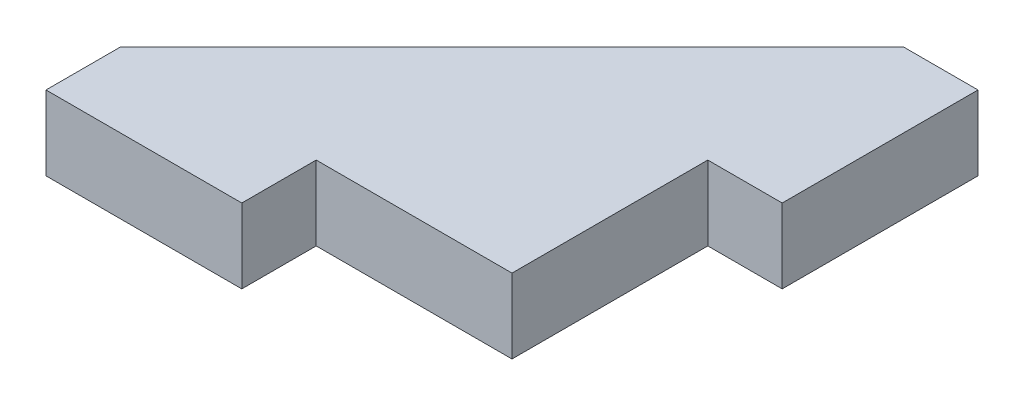
ISO-10303-21;
HEADER;
FILE_DESCRIPTION(('STEP AP214'),'2;1');
FILE_NAME('part.step','',(''),(''),'','','');
FILE_SCHEMA(('AUTOMOTIVE_DESIGN { 1 0 10303 214 1 1 1 1 }'));
ENDSEC;
DATA;
#1=APPLICATION_CONTEXT('core data for automotive mechanical design processes');
#2=APPLICATION_PROTOCOL_DEFINITION('international standard','automotive_design',2000,#1);
#3=PRODUCT_CONTEXT('',#1,'mechanical');
#4=PRODUCT('Part','Part','',(#3));
#5=PRODUCT_RELATED_PRODUCT_CATEGORY('part','',(#4));
#6=PRODUCT_DEFINITION_FORMATION('','',#4);
#7=PRODUCT_DEFINITION_CONTEXT('part definition',#1,'design');
#8=PRODUCT_DEFINITION('design','',#6,#7);
#9=PRODUCT_DEFINITION_SHAPE('','',#8);
#10=(LENGTH_UNIT() NAMED_UNIT(*) SI_UNIT(.MILLI.,.METRE.));
#11=(NAMED_UNIT(*) PLANE_ANGLE_UNIT() SI_UNIT($,.RADIAN.));
#12=(NAMED_UNIT(*) SI_UNIT($,.STERADIAN.) SOLID_ANGLE_UNIT());
#13=UNCERTAINTY_MEASURE_WITH_UNIT(LENGTH_MEASURE(1.E-05),#10,'distance_accuracy_value','');
#14=(GEOMETRIC_REPRESENTATION_CONTEXT(3) GLOBAL_UNCERTAINTY_ASSIGNED_CONTEXT((#13)) GLOBAL_UNIT_ASSIGNED_CONTEXT((#10,
#11,#12)) REPRESENTATION_CONTEXT('',''));
#15=CARTESIAN_POINT('',(0.,0.,0.));
#16=DIRECTION('',(0.,0.,1.));
#17=DIRECTION('',(1.,0.,0.));
#18=AXIS2_PLACEMENT_3D('',#15,#16,#17);
#19=CARTESIAN_POINT('',(-8.36198543722724,4.826,0.));
#20=DIRECTION('',(1.,0.,0.));
#21=DIRECTION('',(0.,0.,-1.));
#22=AXIS2_PLACEMENT_3D('',#19,#20,#21);
#23=PLANE('',#22);
#24=DIRECTION('',(0.,0.,1.));
#25=VECTOR('',#24,1.);
#26=CARTESIAN_POINT('',(-8.36198543722724,0.,0.));
#27=LINE('',#26,#25);
#28=CARTESIAN_POINT('',(-8.36198543722724,0.,13.62211422302));
#29=VERTEX_POINT('',#28);
#30=CARTESIAN_POINT('',(-8.36198543722724,0.,18.44811422302));
#31=VERTEX_POINT('',#30);
#32=EDGE_CURVE('E136',#29,#31,#27,.T.);
#33=ORIENTED_EDGE('',*,*,#32,.F.);
#34=DIRECTION('',(0.,-1.,0.));
#35=VECTOR('',#34,1.);
#36=CARTESIAN_POINT('',(-8.36198543722724,4.826,13.62211422302));
#37=LINE('',#36,#35);
#38=CARTESIAN_POINT('',(-8.36198543722724,4.826,13.62211422302));
#39=VERTEX_POINT('',#38);
#40=EDGE_CURVE('E11',#39,#29,#37,.T.);
#41=ORIENTED_EDGE('',*,*,#40,.F.);
#42=DIRECTION('',(0.,0.,1.));
#43=VECTOR('',#42,1.);
#44=CARTESIAN_POINT('',(-8.36198543722724,4.826,0.));
#45=LINE('',#44,#43);
#46=CARTESIAN_POINT('',(-8.36198543722724,4.826,18.44811422302));
#47=VERTEX_POINT('',#46);
#48=EDGE_CURVE('E158',#39,#47,#45,.T.);
#49=ORIENTED_EDGE('',*,*,#48,.T.);
#50=DIRECTION('',(0.,-1.,0.));
#51=VECTOR('',#50,1.);
#52=CARTESIAN_POINT('',(-8.36198543722724,4.826,18.44811422302));
#53=LINE('',#52,#51);
#54=EDGE_CURVE('E88',#47,#31,#53,.T.);
#55=ORIENTED_EDGE('',*,*,#54,.T.);
#56=EDGE_LOOP('',(#33,#41,#49,#55));
#57=FACE_BOUND('',#56,.T.);
#58=ADVANCED_FACE('F35',(#57),#23,.T.);
#59=CARTESIAN_POINT('',(0.,4.826,13.62211422302));
#60=DIRECTION('',(0.,0.,-1.));
#61=DIRECTION('',(-1.,0.,0.));
#62=AXIS2_PLACEMENT_3D('',#59,#60,#61);
#63=PLANE('',#62);
#64=DIRECTION('',(1.,0.,0.));
#65=VECTOR('',#64,1.);
#66=CARTESIAN_POINT('',(0.,0.,13.62211422302));
#67=LINE('',#66,#65);
#68=CARTESIAN_POINT('',(4.33801456277276,0.,13.62211422302));
#69=VERTEX_POINT('',#68);
#70=EDGE_CURVE('E139',#29,#69,#67,.T.);
#71=ORIENTED_EDGE('',*,*,#70,.T.);
#72=DIRECTION('',(0.,-1.,0.));
#73=VECTOR('',#72,1.);
#74=CARTESIAN_POINT('',(4.33801456277276,4.826,13.62211422302));
#75=LINE('',#74,#73);
#76=CARTESIAN_POINT('',(4.33801456277276,4.826,13.62211422302));
#77=VERTEX_POINT('',#76);
#78=EDGE_CURVE('E43',#77,#69,#75,.T.);
#79=ORIENTED_EDGE('',*,*,#78,.F.);
#80=DIRECTION('',(1.,0.,0.));
#81=VECTOR('',#80,1.);
#82=CARTESIAN_POINT('',(0.,4.826,13.62211422302));
#83=LINE('',#82,#81);
#84=EDGE_CURVE('E188',#39,#77,#83,.T.);
#85=ORIENTED_EDGE('',*,*,#84,.F.);
#86=ORIENTED_EDGE('',*,*,#40,.T.);
#87=EDGE_LOOP('',(#71,#79,#85,#86));
#88=FACE_BOUND('',#87,.T.);
#89=ADVANCED_FACE('F176',(#88),#63,.F.);
#90=CARTESIAN_POINT('',(4.33801456277275,4.826,0.));
#91=DIRECTION('',(1.,0.,0.));
#92=DIRECTION('',(0.,0.,-1.));
#93=AXIS2_PLACEMENT_3D('',#90,#91,#92);
#94=PLANE('',#93);
#95=DIRECTION('',(0.,0.,1.));
#96=VECTOR('',#95,1.);
#97=CARTESIAN_POINT('',(4.33801456277275,0.,0.));
#98=LINE('',#97,#96);
#99=CARTESIAN_POINT('',(4.33801456277275,0.,0.922114223020031));
#100=VERTEX_POINT('',#99);
#101=EDGE_CURVE('E142',#100,#69,#98,.T.);
#102=ORIENTED_EDGE('',*,*,#101,.F.);
#103=DIRECTION('',(0.,-1.,0.));
#104=VECTOR('',#103,1.);
#105=CARTESIAN_POINT('',(4.33801456277275,4.826,0.922114223020031));
#106=LINE('',#105,#104);
#107=CARTESIAN_POINT('',(4.33801456277275,4.826,0.922114223020031));
#108=VERTEX_POINT('',#107);
#109=EDGE_CURVE('E166',#108,#100,#106,.T.);
#110=ORIENTED_EDGE('',*,*,#109,.F.);
#111=DIRECTION('',(0.,0.,1.));
#112=VECTOR('',#111,1.);
#113=CARTESIAN_POINT('',(4.33801456277275,4.826,0.));
#114=LINE('',#113,#112);
#115=EDGE_CURVE('E173',#108,#77,#114,.T.);
#116=ORIENTED_EDGE('',*,*,#115,.T.);
#117=ORIENTED_EDGE('',*,*,#78,.T.);
#118=EDGE_LOOP('',(#102,#110,#116,#117));
#119=FACE_BOUND('',#118,.T.);
#120=ADVANCED_FACE('F171',(#119),#94,.T.);
#121=CARTESIAN_POINT('',(0.,4.826,0.922114223020031));
#122=DIRECTION('',(0.,0.,-1.));
#123=DIRECTION('',(-1.,0.,0.));
#124=AXIS2_PLACEMENT_3D('',#121,#122,#123);
#125=PLANE('',#124);
#126=DIRECTION('',(1.,0.,0.));
#127=VECTOR('',#126,1.);
#128=CARTESIAN_POINT('',(0.,0.,0.922114223020031));
#129=LINE('',#128,#127);
#130=CARTESIAN_POINT('',(9.16401456277275,0.,0.922114223020031));
#131=VERTEX_POINT('',#130);
#132=EDGE_CURVE('E145',#100,#131,#129,.T.);
#133=ORIENTED_EDGE('',*,*,#132,.T.);
#134=DIRECTION('',(0.,-1.,0.));
#135=VECTOR('',#134,1.);
#136=CARTESIAN_POINT('',(9.16401456277275,4.826,0.922114223020031));
#137=LINE('',#136,#135);
#138=CARTESIAN_POINT('',(9.16401456277275,4.826,0.922114223020031));
#139=VERTEX_POINT('',#138);
#140=EDGE_CURVE('E164',#139,#131,#137,.T.);
#141=ORIENTED_EDGE('',*,*,#140,.F.);
#142=DIRECTION('',(1.,0.,0.));
#143=VECTOR('',#142,1.);
#144=CARTESIAN_POINT('',(0.,4.826,0.922114223020031));
#145=LINE('',#144,#143);
#146=EDGE_CURVE('E186',#108,#139,#145,.T.);
#147=ORIENTED_EDGE('',*,*,#146,.F.);
#148=ORIENTED_EDGE('',*,*,#109,.T.);
#149=EDGE_LOOP('',(#133,#141,#147,#148));
#150=FACE_BOUND('',#149,.T.);
#151=ADVANCED_FACE('F183',(#150),#125,.F.);
#152=CARTESIAN_POINT('',(9.16401456277275,4.826,0.));
#153=DIRECTION('',(1.,0.,0.));
#154=DIRECTION('',(0.,0.,-1.));
#155=AXIS2_PLACEMENT_3D('',#152,#153,#154);
#156=PLANE('',#155);
#157=DIRECTION('',(0.,0.,1.));
#158=VECTOR('',#157,1.);
#159=CARTESIAN_POINT('',(9.16401456277275,0.,0.));
#160=LINE('',#159,#158);
#161=CARTESIAN_POINT('',(9.16401456277275,0.,-11.77788577698));
#162=VERTEX_POINT('',#161);
#163=EDGE_CURVE('E148',#162,#131,#160,.T.);
#164=ORIENTED_EDGE('',*,*,#163,.F.);
#165=DIRECTION('',(0.,-1.,0.));
#166=VECTOR('',#165,1.);
#167=CARTESIAN_POINT('',(9.16401456277275,4.826,-11.77788577698));
#168=LINE('',#167,#166);
#169=CARTESIAN_POINT('',(9.16401456277275,4.826,-11.77788577698));
#170=VERTEX_POINT('',#169);
#171=EDGE_CURVE('E162',#170,#162,#168,.T.);
#172=ORIENTED_EDGE('',*,*,#171,.F.);
#173=DIRECTION('',(0.,0.,1.));
#174=VECTOR('',#173,1.);
#175=CARTESIAN_POINT('',(9.16401456277275,4.826,0.));
#176=LINE('',#175,#174);
#177=EDGE_CURVE('E131',#170,#139,#176,.T.);
#178=ORIENTED_EDGE('',*,*,#177,.T.);
#179=ORIENTED_EDGE('',*,*,#140,.T.);
#180=EDGE_LOOP('',(#164,#172,#178,#179));
#181=FACE_BOUND('',#180,.T.);
#182=ADVANCED_FACE('F193',(#181),#156,.T.);
#183=CARTESIAN_POINT('',(0.,4.826,-11.77788577698));
#184=DIRECTION('',(0.,0.,-1.));
#185=DIRECTION('',(-1.,0.,0.));
#186=AXIS2_PLACEMENT_3D('',#183,#184,#185);
#187=PLANE('',#186);
#188=DIRECTION('',(1.,0.,0.));
#189=VECTOR('',#188,1.);
#190=CARTESIAN_POINT('',(0.,0.,-11.77788577698));
#191=LINE('',#190,#189);
#192=CARTESIAN_POINT('',(4.33801456277275,0.,-11.77788577698));
#193=VERTEX_POINT('',#192);
#194=EDGE_CURVE('E151',#193,#162,#191,.T.);
#195=ORIENTED_EDGE('',*,*,#194,.F.);
#196=DIRECTION('',(0.,-1.,0.));
#197=VECTOR('',#196,1.);
#198=CARTESIAN_POINT('',(4.33801456277275,4.826,-11.77788577698));
#199=LINE('',#198,#197);
#200=CARTESIAN_POINT('',(4.33801456277275,4.826,-11.77788577698));
#201=VERTEX_POINT('',#200);
#202=EDGE_CURVE('E119',#201,#193,#199,.T.);
#203=ORIENTED_EDGE('',*,*,#202,.F.);
#204=DIRECTION('',(1.,0.,0.));
#205=VECTOR('',#204,1.);
#206=CARTESIAN_POINT('',(0.,4.826,-11.77788577698));
#207=LINE('',#206,#205);
#208=EDGE_CURVE('E129',#201,#170,#207,.T.);
#209=ORIENTED_EDGE('',*,*,#208,.T.);
#210=ORIENTED_EDGE('',*,*,#171,.T.);
#211=EDGE_LOOP('',(#195,#203,#209,#210));
#212=FACE_BOUND('',#211,.T.);
#213=ADVANCED_FACE('F196',(#212),#187,.T.);
#214=CARTESIAN_POINT('',(-3.71993560710361,4.826,-3.71993560710361));
#215=DIRECTION('',(-0.707106781186548,0.,-0.707106781186547));
#216=DIRECTION('',(-0.707106781186547,0.,0.707106781186548));
#217=AXIS2_PLACEMENT_3D('',#214,#215,#216);
#218=PLANE('',#217);
#219=DIRECTION('',(0.707106781186547,0.,-0.707106781186548));
#220=VECTOR('',#219,1.);
#221=CARTESIAN_POINT('',(-3.71993560710361,0.,-3.71993560710361));
#222=LINE('',#221,#220);
#223=CARTESIAN_POINT('',(-21.0619854372272,0.,13.62211422302));
#224=VERTEX_POINT('',#223);
#225=EDGE_CURVE('E118',#224,#193,#222,.T.);
#226=ORIENTED_EDGE('',*,*,#225,.F.);
#227=DIRECTION('',(0.,-1.,0.));
#228=VECTOR('',#227,1.);
#229=CARTESIAN_POINT('',(-21.0619854372272,4.826,13.62211422302));
#230=LINE('',#229,#228);
#231=CARTESIAN_POINT('',(-21.0619854372272,4.826,13.62211422302));
#232=VERTEX_POINT('',#231);
#233=EDGE_CURVE('E112',#232,#224,#230,.T.);
#234=ORIENTED_EDGE('',*,*,#233,.F.);
#235=DIRECTION('',(0.707106781186547,0.,-0.707106781186548));
#236=VECTOR('',#235,1.);
#237=CARTESIAN_POINT('',(-3.71993560710361,4.826,-3.71993560710361));
#238=LINE('',#237,#236);
#239=EDGE_CURVE('E116',#232,#201,#238,.T.);
#240=ORIENTED_EDGE('',*,*,#239,.T.);
#241=ORIENTED_EDGE('',*,*,#202,.T.);
#242=EDGE_LOOP('',(#226,#234,#240,#241));
#243=FACE_BOUND('',#242,.T.);
#244=ADVANCED_FACE('F114',(#243),#218,.T.);
#245=CARTESIAN_POINT('',(-21.0619854372272,4.826,0.));
#246=DIRECTION('',(1.,0.,0.));
#247=DIRECTION('',(0.,0.,-1.));
#248=AXIS2_PLACEMENT_3D('',#245,#246,#247);
#249=PLANE('',#248);
#250=DIRECTION('',(0.,0.,1.));
#251=VECTOR('',#250,1.);
#252=CARTESIAN_POINT('',(-21.0619854372272,0.,0.));
#253=LINE('',#252,#251);
#254=CARTESIAN_POINT('',(-21.0619854372272,0.,18.44811422302));
#255=VERTEX_POINT('',#254);
#256=EDGE_CURVE('E81',#224,#255,#253,.T.);
#257=ORIENTED_EDGE('',*,*,#256,.T.);
#258=DIRECTION('',(0.,-1.,0.));
#259=VECTOR('',#258,1.);
#260=CARTESIAN_POINT('',(-21.0619854372272,4.826,18.44811422302));
#261=LINE('',#260,#259);
#262=CARTESIAN_POINT('',(-21.0619854372272,4.826,18.44811422302));
#263=VERTEX_POINT('',#262);
#264=EDGE_CURVE('E120',#263,#255,#261,.T.);
#265=ORIENTED_EDGE('',*,*,#264,.F.);
#266=DIRECTION('',(0.,0.,1.));
#267=VECTOR('',#266,1.);
#268=CARTESIAN_POINT('',(-21.0619854372272,4.826,0.));
#269=LINE('',#268,#267);
#270=EDGE_CURVE('E122',#232,#263,#269,.T.);
#271=ORIENTED_EDGE('',*,*,#270,.F.);
#272=ORIENTED_EDGE('',*,*,#233,.T.);
#273=EDGE_LOOP('',(#257,#265,#271,#272));
#274=FACE_BOUND('',#273,.T.);
#275=ADVANCED_FACE('F123',(#274),#249,.F.);
#276=CARTESIAN_POINT('',(0.,4.826,18.44811422302));
#277=DIRECTION('',(0.,0.,-1.));
#278=DIRECTION('',(-1.,0.,0.));
#279=AXIS2_PLACEMENT_3D('',#276,#277,#278);
#280=PLANE('',#279);
#281=DIRECTION('',(1.,0.,0.));
#282=VECTOR('',#281,1.);
#283=CARTESIAN_POINT('',(0.,0.,18.44811422302));
#284=LINE('',#283,#282);
#285=EDGE_CURVE('E156',#255,#31,#284,.T.);
#286=ORIENTED_EDGE('',*,*,#285,.T.);
#287=ORIENTED_EDGE('',*,*,#54,.F.);
#288=DIRECTION('',(1.,0.,0.));
#289=VECTOR('',#288,1.);
#290=CARTESIAN_POINT('',(0.,4.826,18.44811422302));
#291=LINE('',#290,#289);
#292=EDGE_CURVE('E51',#263,#47,#291,.T.);
#293=ORIENTED_EDGE('',*,*,#292,.F.);
#294=ORIENTED_EDGE('',*,*,#264,.T.);
#295=EDGE_LOOP('',(#286,#287,#293,#294));
#296=FACE_BOUND('',#295,.T.);
#297=ADVANCED_FACE('F199',(#296),#280,.F.);
#298=CARTESIAN_POINT('',(0.,4.826,0.));
#299=DIRECTION('',(0.,1.,0.));
#300=DIRECTION('',(0.,0.,1.));
#301=AXIS2_PLACEMENT_3D('',#298,#299,#300);
#302=PLANE('',#301);
#303=ORIENTED_EDGE('',*,*,#48,.F.);
#304=ORIENTED_EDGE('',*,*,#84,.T.);
#305=ORIENTED_EDGE('',*,*,#115,.F.);
#306=ORIENTED_EDGE('',*,*,#146,.T.);
#307=ORIENTED_EDGE('',*,*,#177,.F.);
#308=ORIENTED_EDGE('',*,*,#208,.F.);
#309=ORIENTED_EDGE('',*,*,#239,.F.);
#310=ORIENTED_EDGE('',*,*,#270,.T.);
#311=ORIENTED_EDGE('',*,*,#292,.T.);
#312=EDGE_LOOP('',(#303,#304,#305,#306,#307,#308,#309,#310,#311));
#313=FACE_BOUND('',#312,.T.);
#314=ADVANCED_FACE('F126',(#313),#302,.T.);
#315=CARTESIAN_POINT('',(0.,0.,0.));
#316=DIRECTION('',(0.,1.,0.));
#317=DIRECTION('',(0.,0.,1.));
#318=AXIS2_PLACEMENT_3D('',#315,#316,#317);
#319=PLANE('',#318);
#320=ORIENTED_EDGE('',*,*,#32,.T.);
#321=ORIENTED_EDGE('',*,*,#285,.F.);
#322=ORIENTED_EDGE('',*,*,#256,.F.);
#323=ORIENTED_EDGE('',*,*,#225,.T.);
#324=ORIENTED_EDGE('',*,*,#194,.T.);
#325=ORIENTED_EDGE('',*,*,#163,.T.);
#326=ORIENTED_EDGE('',*,*,#132,.F.);
#327=ORIENTED_EDGE('',*,*,#101,.T.);
#328=ORIENTED_EDGE('',*,*,#70,.F.);
#329=EDGE_LOOP('',(#320,#321,#322,#323,#324,#325,#326,#327,#328));
#330=FACE_BOUND('',#329,.T.);
#331=ADVANCED_FACE('F179',(#330),#319,.F.);
#332=CLOSED_SHELL('',(#58,#89,#120,#151,#182,#213,#244,#275,#297,#314,#331));
#333=MANIFOLD_SOLID_BREP('B2',#332);
#334=ADVANCED_BREP_SHAPE_REPRESENTATION('',(#18,#333),#14);
#335=SHAPE_DEFINITION_REPRESENTATION(#9,#334);
ENDSEC;
END-ISO-10303-21;
